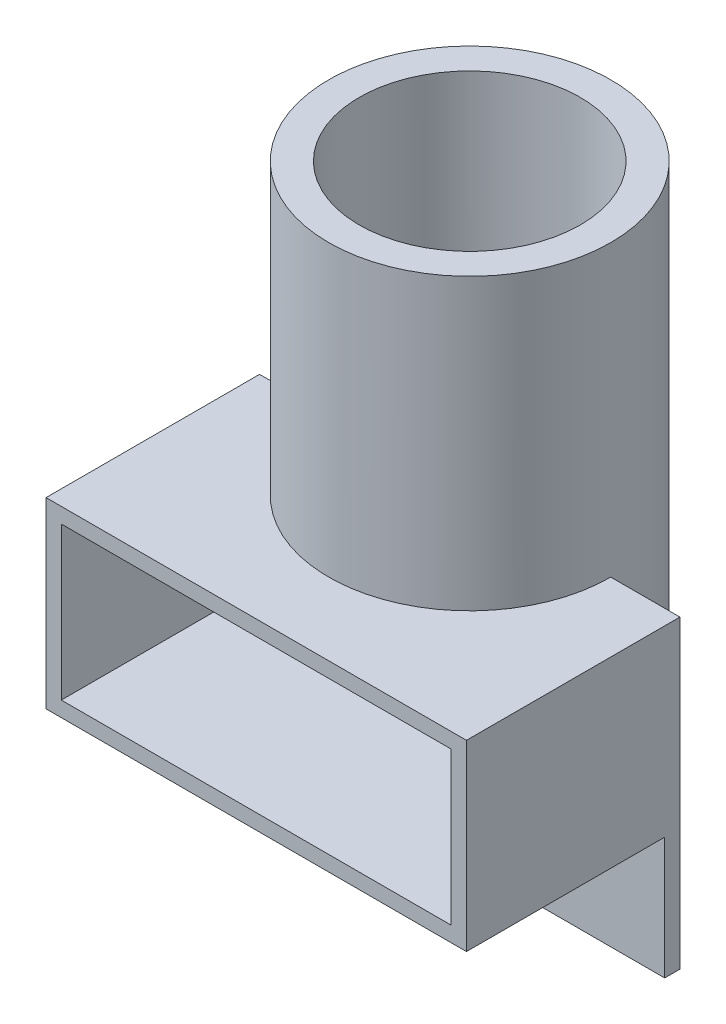
ISO-10303-21;
HEADER;
FILE_DESCRIPTION(('STEP AP214'),'2;1');
FILE_NAME('part.step','',(''),(''),'','','');
FILE_SCHEMA(('AUTOMOTIVE_DESIGN { 1 0 10303 214 1 1 1 1 }'));
ENDSEC;
DATA;
#1=APPLICATION_CONTEXT('core data for automotive mechanical design processes');
#2=APPLICATION_PROTOCOL_DEFINITION('international standard','automotive_design',2000,#1);
#3=PRODUCT_CONTEXT('',#1,'mechanical');
#4=PRODUCT('Part','Part','',(#3));
#5=PRODUCT_RELATED_PRODUCT_CATEGORY('part','',(#4));
#6=PRODUCT_DEFINITION_FORMATION('','',#4);
#7=PRODUCT_DEFINITION_CONTEXT('part definition',#1,'design');
#8=PRODUCT_DEFINITION('design','',#6,#7);
#9=PRODUCT_DEFINITION_SHAPE('','',#8);
#10=(LENGTH_UNIT() NAMED_UNIT(*) SI_UNIT(.MILLI.,.METRE.));
#11=(NAMED_UNIT(*) PLANE_ANGLE_UNIT() SI_UNIT($,.RADIAN.));
#12=(NAMED_UNIT(*) SI_UNIT($,.STERADIAN.) SOLID_ANGLE_UNIT());
#13=UNCERTAINTY_MEASURE_WITH_UNIT(LENGTH_MEASURE(1.E-05),#10,'distance_accuracy_value','');
#14=(GEOMETRIC_REPRESENTATION_CONTEXT(3) GLOBAL_UNCERTAINTY_ASSIGNED_CONTEXT((#13)) GLOBAL_UNIT_ASSIGNED_CONTEXT((#10,
#11,#12)) REPRESENTATION_CONTEXT('',''));
#15=CARTESIAN_POINT('',(0.,0.,0.));
#16=DIRECTION('',(0.,0.,1.));
#17=DIRECTION('',(1.,0.,0.));
#18=AXIS2_PLACEMENT_3D('',#15,#16,#17);
#19=CARTESIAN_POINT('',(-13.785,-12.,14.));
#20=DIRECTION('',(0.,1.,0.));
#21=DIRECTION('',(0.,0.,1.));
#22=AXIS2_PLACEMENT_3D('',#19,#20,#21);
#23=PLANE('',#22);
#24=DIRECTION('',(-1.,0.,0.));
#25=VECTOR('',#24,1.);
#26=CARTESIAN_POINT('',(-13.785,-12.,1.));
#27=LINE('',#26,#25);
#28=CARTESIAN_POINT('',(13.785,-12.,0.999999999999999));
#29=VERTEX_POINT('',#28);
#30=CARTESIAN_POINT('',(-13.785,-12.,1.));
#31=VERTEX_POINT('',#30);
#32=EDGE_CURVE('E59',#29,#31,#27,.T.);
#33=ORIENTED_EDGE('',*,*,#32,.F.);
#34=DIRECTION('',(0.,0.,-1.));
#35=VECTOR('',#34,1.);
#36=CARTESIAN_POINT('',(13.785,-12.,14.));
#37=LINE('',#36,#35);
#38=CARTESIAN_POINT('',(13.785,-12.,14.));
#39=VERTEX_POINT('',#38);
#40=EDGE_CURVE('E237',#39,#29,#37,.T.);
#41=ORIENTED_EDGE('',*,*,#40,.F.);
#42=DIRECTION('',(1.,0.,0.));
#43=VECTOR('',#42,1.);
#44=CARTESIAN_POINT('',(-13.785,-12.,14.));
#45=LINE('',#44,#43);
#46=CARTESIAN_POINT('',(-13.785,-12.,14.));
#47=VERTEX_POINT('',#46);
#48=EDGE_CURVE('E222',#47,#39,#45,.T.);
#49=ORIENTED_EDGE('',*,*,#48,.F.);
#50=DIRECTION('',(0.,0.,-1.));
#51=VECTOR('',#50,1.);
#52=CARTESIAN_POINT('',(-13.785,-12.,14.));
#53=LINE('',#52,#51);
#54=EDGE_CURVE('E239',#47,#31,#53,.T.);
#55=ORIENTED_EDGE('',*,*,#54,.T.);
#56=EDGE_LOOP('',(#33,#41,#49,#55));
#57=FACE_BOUND('',#56,.T.);
#58=ADVANCED_FACE('F39',(#57),#23,.F.);
#59=CARTESIAN_POINT('',(0.,19.,0.));
#60=DIRECTION('',(0.,1.,0.));
#61=DIRECTION('',(0.,0.,1.));
#62=AXIS2_PLACEMENT_3D('',#59,#60,#61);
#63=PLANE('',#62);
#64=CARTESIAN_POINT('',(0.,19.,0.));
#65=DIRECTION('',(0.,1.,0.));
#66=DIRECTION('',(0.,0.,1.));
#67=AXIS2_PLACEMENT_3D('',#64,#65,#66);
#68=CIRCLE('',#67,9.25);
#69=CARTESIAN_POINT('',(0.,19.,9.25));
#70=VERTEX_POINT('',#69);
#71=EDGE_CURVE('E269',#70,#70,#68,.T.);
#72=ORIENTED_EDGE('',*,*,#71,.T.);
#73=EDGE_LOOP('',(#72));
#74=FACE_BOUND('',#73,.T.);
#75=CARTESIAN_POINT('',(0.,19.,0.));
#76=DIRECTION('',(0.,1.,0.));
#77=DIRECTION('',(1.,0.,0.));
#78=AXIS2_PLACEMENT_3D('',#75,#76,#77);
#79=CIRCLE('',#78,7.25);
#80=CARTESIAN_POINT('',(7.25,19.,0.));
#81=VERTEX_POINT('',#80);
#82=EDGE_CURVE('E263',#81,#81,#79,.T.);
#83=ORIENTED_EDGE('',*,*,#82,.F.);
#84=EDGE_LOOP('',(#83));
#85=FACE_BOUND('',#84,.T.);
#86=ADVANCED_FACE('F289',(#74,#85),#63,.T.);
#87=CARTESIAN_POINT('',(0.,19.,0.));
#88=DIRECTION('',(0.,-1.,0.));
#89=DIRECTION('',(0.,0.,-1.));
#90=AXIS2_PLACEMENT_3D('',#87,#88,#89);
#91=CYLINDRICAL_SURFACE('',#90,9.25);
#92=ORIENTED_EDGE('',*,*,#71,.F.);
#93=EDGE_LOOP('',(#92));
#94=FACE_BOUND('',#93,.T.);
#95=CARTESIAN_POINT('',(0.,0.,0.));
#96=DIRECTION('',(0.,1.,0.));
#97=DIRECTION('',(0.,0.,1.));
#98=AXIS2_PLACEMENT_3D('',#95,#96,#97);
#99=CIRCLE('',#98,9.25);
#100=CARTESIAN_POINT('',(-9.25,0.,0.));
#101=VERTEX_POINT('',#100);
#102=CARTESIAN_POINT('',(9.25,0.,0.));
#103=VERTEX_POINT('',#102);
#104=EDGE_CURVE('E266',#101,#103,#99,.T.);
#105=ORIENTED_EDGE('',*,*,#104,.T.);
#106=DIRECTION('',(0.,1.,0.));
#107=VECTOR('',#106,1.);
#108=CARTESIAN_POINT('',(9.25,-11.,0.));
#109=LINE('',#108,#107);
#110=CARTESIAN_POINT('',(9.25,-11.,0.));
#111=VERTEX_POINT('',#110);
#112=EDGE_CURVE('E254',#111,#103,#109,.T.);
#113=ORIENTED_EDGE('',*,*,#112,.F.);
#114=CARTESIAN_POINT('',(0.,-11.,0.));
#115=DIRECTION('',(0.,1.,0.));
#116=DIRECTION('',(1.,0.,0.));
#117=AXIS2_PLACEMENT_3D('',#114,#115,#116);
#118=CIRCLE('',#117,9.25);
#119=CARTESIAN_POINT('',(-9.25,-11.,0.));
#120=VERTEX_POINT('',#119);
#121=EDGE_CURVE('E241',#111,#120,#118,.T.);
#122=ORIENTED_EDGE('',*,*,#121,.T.);
#123=DIRECTION('',(0.,1.,0.));
#124=VECTOR('',#123,1.);
#125=CARTESIAN_POINT('',(-9.25,-11.,0.));
#126=LINE('',#125,#124);
#127=EDGE_CURVE('E253',#120,#101,#126,.T.);
#128=ORIENTED_EDGE('',*,*,#127,.T.);
#129=EDGE_LOOP('',(#105,#113,#122,#128));
#130=FACE_BOUND('',#129,.T.);
#131=ADVANCED_FACE('F286',(#94,#130),#91,.T.);
#132=CARTESIAN_POINT('',(0.,19.,0.));
#133=DIRECTION('',(0.,-1.,0.));
#134=DIRECTION('',(0.,0.,-1.));
#135=AXIS2_PLACEMENT_3D('',#132,#133,#134);
#136=CYLINDRICAL_SURFACE('',#135,7.25);
#137=ORIENTED_EDGE('',*,*,#82,.T.);
#138=EDGE_LOOP('',(#137));
#139=FACE_BOUND('',#138,.T.);
#140=CARTESIAN_POINT('',(0.,0.,0.));
#141=DIRECTION('',(0.,1.,0.));
#142=DIRECTION('',(1.,0.,0.));
#143=AXIS2_PLACEMENT_3D('',#140,#141,#142);
#144=CIRCLE('',#143,7.25);
#145=CARTESIAN_POINT('',(-5.25,0.,5.));
#146=VERTEX_POINT('',#145);
#147=CARTESIAN_POINT('',(5.25,0.,5.));
#148=VERTEX_POINT('',#147);
#149=EDGE_CURVE('E256',#146,#148,#144,.T.);
#150=ORIENTED_EDGE('',*,*,#149,.F.);
#151=CARTESIAN_POINT('',(-5.25,0.,5.));
#152=CARTESIAN_POINT('',(-5.3451145283237,6.72036745505073E-06,4.90016158246677));
#153=CARTESIAN_POINT('',(-5.43738218212727,-0.00299091061629793,4.79754530995999));
#154=CARTESIAN_POINT('',(-5.61580223936952,-0.0159419032229641,4.58739550009041));
#155=CARTESIAN_POINT('',(-5.70194904364744,-0.0259015454774106,4.47985760471527));
#156=CARTESIAN_POINT('',(-5.86783992149923,-0.0537787125170177,4.26027876062175));
#157=CARTESIAN_POINT('',(-5.94755901119815,-0.0717256732301227,4.14822256258746));
#158=CARTESIAN_POINT('',(-6.09973829113947,-0.11643635995096,3.92101703700398));
#159=CARTESIAN_POINT('',(-6.17220066770498,-0.143197419937248,3.80586865441627));
#160=CARTESIAN_POINT('',(-6.30993058437847,-0.206455006489721,3.57291173916938));
#161=CARTESIAN_POINT('',(-6.37515042969233,-0.243011214241286,3.45509109417369));
#162=CARTESIAN_POINT('',(-6.49761494434465,-0.326318480212601,3.218881607688));
#163=CARTESIAN_POINT('',(-6.55485887032841,-0.373070487639397,3.10049271429957));
#164=CARTESIAN_POINT('',(-6.66113998087318,-0.476905770082516,2.86502272720656));
#165=CARTESIAN_POINT('',(-6.71019973373815,-0.533959699671592,2.74793889670932));
#166=CARTESIAN_POINT('',(-6.80044608266931,-0.658499139606163,2.51632264936274));
#167=CARTESIAN_POINT('',(-6.84163352366435,-0.725983529051121,2.40178995986855));
#168=CARTESIAN_POINT('',(-6.91277736187319,-0.863904929726459,2.18801596647575));
#169=CARTESIAN_POINT('',(-6.9434436213029,-0.933379290067125,2.08838741677289));
#170=CARTESIAN_POINT('',(-6.99911652319446,-1.08027610870968,1.89344841871119));
#171=CARTESIAN_POINT('',(-7.02412123140949,-1.15770127027972,1.7981394549901));
#172=CARTESIAN_POINT('',(-7.06898611954651,-1.32006979901924,1.6127732090239));
#173=CARTESIAN_POINT('',(-7.08884334493652,-1.40501744655615,1.52271896573832));
#174=CARTESIAN_POINT('',(-7.12399807100813,-1.58188331895337,1.3487160222802));
#175=CARTESIAN_POINT('',(-7.13929388686244,-1.67380410376358,1.26476958675512));
#176=CARTESIAN_POINT('',(-7.16603801573699,-1.86455870452197,1.10324211577086));
#177=CARTESIAN_POINT('',(-7.17746271562469,-1.96343065702698,1.02570225357129));
#178=CARTESIAN_POINT('',(-7.19700939448587,-2.16699026298681,0.878123253014978));
#179=CARTESIAN_POINT('',(-7.20512995274514,-2.2716803961986,0.808087350724071));
#180=CARTESIAN_POINT('',(-7.21871674335994,-2.48618409156783,0.67604421019692));
#181=CARTESIAN_POINT('',(-7.22418267015229,-2.59599824193498,0.614037896814176));
#182=CARTESIAN_POINT('',(-7.23307595415756,-2.82006478878222,0.498469663703473));
#183=CARTESIAN_POINT('',(-7.23650320361074,-2.93431741953006,0.444908190460046));
#184=CARTESIAN_POINT('',(-7.24208201015305,-3.17531735694903,0.342863619284048));
#185=CARTESIAN_POINT('',(-7.24411818570104,-3.30235798125257,0.295065807894278));
#186=CARTESIAN_POINT('',(-7.2470840567468,-3.55987412384438,0.209966438653844));
#187=CARTESIAN_POINT('',(-7.24801408969467,-3.6903485821537,0.172661682347623));
#188=CARTESIAN_POINT('',(-7.24925362277717,-3.95374481193901,0.108814557190168));
#189=CARTESIAN_POINT('',(-7.24956383121627,-4.08666361456563,0.082259931341745));
#190=CARTESIAN_POINT('',(-7.24992040275255,-4.3541651217917,0.0400386669042414));
#191=CARTESIAN_POINT('',(-7.24996690500028,-4.48874691129719,0.024366289881953));
#192=CARTESIAN_POINT('',(-7.24999505899875,-4.68635358667279,0.00945129871457457));
#193=CARTESIAN_POINT('',(-7.24999810836349,-4.74907951051302,0.00590488536153686));
#194=CARTESIAN_POINT('',(-7.25000016113569,-4.87453469872719,0.00118093769944767));
#195=CARTESIAN_POINT('',(-7.24999917006386,-4.93726384151095,1.74346020091124E-07));
#196=CARTESIAN_POINT('',(-7.25,-5.,0.));
#197=B_SPLINE_CURVE_WITH_KNOTS('',3,(#151,#152,#153,#154,#155,#156,#157,#158,#159,#160,#161,
#162,#163,#164,#165,#166,#167,#168,#169,#170,#171,#172,#173,#174,#175,#176,#177,#178,#179,#180,
#181,#182,#183,#184,#185,#186,#187,#188,#189,#190,#191,#192,#193,#194,#195,#196),.UNSPECIFIED.,
.F.,.F.,(4,2,2,2,2,2,2,2,2,2,2,2,2,2,2,2,2,2,2,2,2,2,4),(0.,0.413661467971635,0.827696594321726,
1.24327037843539,1.6587185782243,2.07675802079351,2.49483639856348,2.91174213058768,
3.32860309130095,3.7039672367654,4.07945943106528,4.45516667406093,4.83101251895163,
5.20911133786372,5.58737256026909,5.96567731238001,6.34400205902236,6.75079123968589,
7.15745628961978,7.56365635666923,7.96964206308146,8.15808280479186,8.34626615457649),.UNSPECIFIED.);
#198=CARTESIAN_POINT('',(-7.25,-5.,0.));
#199=VERTEX_POINT('',#198);
#200=EDGE_CURVE('E52',#146,#199,#197,.T.);
#201=ORIENTED_EDGE('',*,*,#200,.T.);
#202=DIRECTION('',(0.,1.,0.));
#203=VECTOR('',#202,1.);
#204=CARTESIAN_POINT('',(-7.25,-11.,0.));
#205=LINE('',#204,#203);
#206=CARTESIAN_POINT('',(-7.25,-11.,0.));
#207=VERTEX_POINT('',#206);
#208=EDGE_CURVE('E259',#207,#199,#205,.T.);
#209=ORIENTED_EDGE('',*,*,#208,.F.);
#210=CARTESIAN_POINT('',(0.,-11.,0.));
#211=DIRECTION('',(0.,1.,0.));
#212=DIRECTION('',(0.,0.,1.));
#213=AXIS2_PLACEMENT_3D('',#210,#211,#212);
#214=CIRCLE('',#213,7.25);
#215=CARTESIAN_POINT('',(7.25,-11.,0.));
#216=VERTEX_POINT('',#215);
#217=EDGE_CURVE('E247',#216,#207,#214,.T.);
#218=ORIENTED_EDGE('',*,*,#217,.F.);
#219=DIRECTION('',(0.,1.,0.));
#220=VECTOR('',#219,1.);
#221=CARTESIAN_POINT('',(7.25,-11.,0.));
#222=LINE('',#221,#220);
#223=CARTESIAN_POINT('',(7.25,-5.,0.));
#224=VERTEX_POINT('',#223);
#225=EDGE_CURVE('E257',#216,#224,#222,.T.);
#226=ORIENTED_EDGE('',*,*,#225,.T.);
#227=CARTESIAN_POINT('',(7.25,-5.,0.));
#228=CARTESIAN_POINT('',(7.24996976463803,-4.86005571811214,-1.48250933784358E-05));
#229=CARTESIAN_POINT('',(7.24999904964399,-4.72011353748819,0.00587470339202107));
#230=CARTESIAN_POINT('',(7.24995815241415,-4.44121797609597,0.0293555967045467));
#231=CARTESIAN_POINT('',(7.24988797293112,-4.3022645680693,0.0469466376721602));
#232=CARTESIAN_POINT('',(7.24942956379429,-4.02626461165057,0.0937336439348905));
#233=CARTESIAN_POINT('',(7.24904119887723,-3.88921889943845,0.122934541957996));
#234=CARTESIAN_POINT('',(7.24752240686202,-3.61806526577579,0.192729251203325));
#235=CARTESIAN_POINT('',(7.24639198899191,-3.48395730781328,0.233322920743416));
#236=CARTESIAN_POINT('',(7.24283018555517,-3.21955371424099,0.325641096600181));
#237=CARTESIAN_POINT('',(7.2403980151502,-3.0892604285664,0.377372306581703));
#238=CARTESIAN_POINT('',(7.23354090365725,-2.83347139013595,0.4915880932716));
#239=CARTESIAN_POINT('',(7.22911526448352,-2.70797733472164,0.554076432240735));
#240=CARTESIAN_POINT('',(7.21747931174951,-2.46284243398618,0.689267910410459));
#241=CARTESIAN_POINT('',(7.21027061671815,-2.34319823207296,0.761965096892798));
#242=CARTESIAN_POINT('',(7.19219839033466,-2.1106144887642,0.916988895251322));
#243=CARTESIAN_POINT('',(7.18133511181111,-1.99767448419975,0.999314840741225));
#244=CARTESIAN_POINT('',(7.15529405053158,-1.78147944154935,1.17118445710116));
#245=CARTESIAN_POINT('',(7.1402026769215,-1.67808057787443,1.26056015045233));
#246=CARTESIAN_POINT('',(7.10477679610745,-1.47944520746101,1.44694050930957));
#247=CARTESIAN_POINT('',(7.08444454626402,-1.38420520999259,1.54394187779875));
#248=CARTESIAN_POINT('',(7.03773792176752,-1.20261619384074,1.74451708416717));
#249=CARTESIAN_POINT('',(7.01136609082867,-1.11626345420544,1.848088141824));
#250=CARTESIAN_POINT('',(6.95187292169265,-0.953030624999543,2.06061449237426));
#251=CARTESIAN_POINT('',(6.91875211946962,-0.876149783989175,2.16956935718883));
#252=CARTESIAN_POINT('',(6.84790498656479,-0.737576599463736,2.38336651478872));
#253=CARTESIAN_POINT('',(6.81069281442489,-0.675184585231736,2.48792658651383));
#254=CARTESIAN_POINT('',(6.72970881173504,-0.559120834241422,2.69931967764757));
#255=CARTESIAN_POINT('',(6.68593716491928,-0.50544885331832,2.80615263331967));
#256=CARTESIAN_POINT('',(6.59169210832506,-0.406838369656374,3.02090158664644));
#257=CARTESIAN_POINT('',(6.54121781923854,-0.361901014706962,3.12881772468186));
#258=CARTESIAN_POINT('',(6.43359033308065,-0.280599824378117,3.34453947315803));
#259=CARTESIAN_POINT('',(6.37643723617048,-0.244235860449364,3.45234508523188));
#260=CARTESIAN_POINT('',(6.2570454580368,-0.180501323180982,3.6641936403001));
#261=CARTESIAN_POINT('',(6.19495991417058,-0.152937559572754,3.76826511722247));
#262=CARTESIAN_POINT('',(6.06479010104923,-0.10517648414601,3.97437846020822));
#263=CARTESIAN_POINT('',(5.99670335402278,-0.08498223290094,4.07641946641768));
#264=CARTESIAN_POINT('',(5.85493812958421,-0.0514209700585268,4.27753732962137));
#265=CARTESIAN_POINT('',(5.78126497967316,-0.0380475455088263,4.37661688813834));
#266=CARTESIAN_POINT('',(5.62861767241399,-0.0174541755632059,4.57126430607824));
#267=CARTESIAN_POINT('',(5.54964372395558,-0.0102339878387697,4.66683230365261));
#268=CARTESIAN_POINT('',(5.43273462242104,-0.00378982501425234,4.80112686516217));
#269=CARTESIAN_POINT('',(5.39678385400653,-0.00235272672764875,4.84150268713879));
#270=CARTESIAN_POINT('',(5.3240341885731,-0.000458677663046953,4.92138932847025));
#271=CARTESIAN_POINT('',(5.28723672852402,-1.74558942454911E-07,4.96090141923592));
#272=CARTESIAN_POINT('',(5.25,0.,5.));
#273=B_SPLINE_CURVE_WITH_KNOTS('',3,(#227,#228,#229,#230,#231,#232,#233,#234,#235,#236,#237,
#238,#239,#240,#241,#242,#243,#244,#245,#246,#247,#248,#249,#250,#251,#252,#253,#254,#255,#256,
#257,#258,#259,#260,#261,#262,#263,#264,#265,#266,#267,#268,#269,#270,#271,#272),.UNSPECIFIED.,
.F.,.F.,(4,2,2,2,2,2,2,2,2,2,2,2,2,2,2,2,2,2,2,2,2,2,4),(0.,0.419705998981521,0.839400382359899,
1.25927327391011,1.67914094409246,2.09926204190632,2.51953037495236,2.93955466177625,
3.35954989677909,3.77151975219701,4.18331245879679,4.59493204696039,5.00651895880574,
5.3879966641564,5.76946368612107,6.15098080161576,6.53249219628361,6.90493698278398,
7.27753627080562,7.64978459157754,8.02201825168307,8.18424266542027,8.34620955394533),.UNSPECIFIED.);
#274=EDGE_CURVE('E12',#224,#148,#273,.T.);
#275=ORIENTED_EDGE('',*,*,#274,.T.);
#276=EDGE_LOOP('',(#150,#201,#209,#218,#226,#275));
#277=FACE_BOUND('',#276,.T.);
#278=ADVANCED_FACE('F280',(#139,#277),#136,.F.);
#279=CARTESIAN_POINT('',(0.,-11.,0.));
#280=DIRECTION('',(0.,1.,0.));
#281=DIRECTION('',(1.,0.,0.));
#282=AXIS2_PLACEMENT_3D('',#279,#280,#281);
#283=PLANE('',#282);
#284=ORIENTED_EDGE('',*,*,#121,.F.);
#285=DIRECTION('',(-1.,0.,0.));
#286=VECTOR('',#285,1.);
#287=CARTESIAN_POINT('',(9.25,-11.,0.));
#288=LINE('',#287,#286);
#289=EDGE_CURVE('E250',#111,#216,#288,.T.);
#290=ORIENTED_EDGE('',*,*,#289,.T.);
#291=ORIENTED_EDGE('',*,*,#217,.T.);
#292=DIRECTION('',(-1.,0.,0.));
#293=VECTOR('',#292,1.);
#294=CARTESIAN_POINT('',(-7.25,-11.,0.));
#295=LINE('',#294,#293);
#296=EDGE_CURVE('E244',#207,#120,#295,.T.);
#297=ORIENTED_EDGE('',*,*,#296,.T.);
#298=EDGE_LOOP('',(#284,#290,#291,#297));
#299=FACE_BOUND('',#298,.T.);
#300=ADVANCED_FACE('F285',(#299),#283,.F.);
#301=CARTESIAN_POINT('',(-13.785,0.,14.));
#302=DIRECTION('',(0.,-1.,0.));
#303=DIRECTION('',(0.,0.,-1.));
#304=AXIS2_PLACEMENT_3D('',#301,#302,#303);
#305=PLANE('',#304);
#306=DIRECTION('',(-1.,0.,0.));
#307=VECTOR('',#306,1.);
#308=CARTESIAN_POINT('',(-13.785,0.,0.));
#309=LINE('',#308,#307);
#310=CARTESIAN_POINT('',(13.785,0.,0.));
#311=VERTEX_POINT('',#310);
#312=EDGE_CURVE('E223',#311,#103,#309,.T.);
#313=ORIENTED_EDGE('',*,*,#312,.T.);
#314=ORIENTED_EDGE('',*,*,#104,.F.);
#315=CARTESIAN_POINT('',(-13.785,0.,0.));
#316=VERTEX_POINT('',#315);
#317=EDGE_CURVE('E230',#101,#316,#309,.T.);
#318=ORIENTED_EDGE('',*,*,#317,.T.);
#319=DIRECTION('',(0.,0.,-1.));
#320=VECTOR('',#319,1.);
#321=CARTESIAN_POINT('',(-13.785,0.,14.));
#322=LINE('',#321,#320);
#323=CARTESIAN_POINT('',(-13.785,0.,14.));
#324=VERTEX_POINT('',#323);
#325=EDGE_CURVE('E161',#324,#316,#322,.T.);
#326=ORIENTED_EDGE('',*,*,#325,.F.);
#327=DIRECTION('',(-1.,0.,0.));
#328=VECTOR('',#327,1.);
#329=CARTESIAN_POINT('',(-13.785,0.,14.));
#330=LINE('',#329,#328);
#331=CARTESIAN_POINT('',(13.785,0.,14.));
#332=VERTEX_POINT('',#331);
#333=EDGE_CURVE('E227',#332,#324,#330,.T.);
#334=ORIENTED_EDGE('',*,*,#333,.F.);
#335=DIRECTION('',(0.,0.,-1.));
#336=VECTOR('',#335,1.);
#337=CARTESIAN_POINT('',(13.785,0.,14.));
#338=LINE('',#337,#336);
#339=EDGE_CURVE('E234',#332,#311,#338,.T.);
#340=ORIENTED_EDGE('',*,*,#339,.T.);
#341=EDGE_LOOP('',(#313,#314,#318,#326,#334,#340));
#342=FACE_BOUND('',#341,.T.);
#343=ADVANCED_FACE('F313',(#342),#305,.F.);
#344=CARTESIAN_POINT('',(0.,0.,0.));
#345=DIRECTION('',(0.,0.,1.));
#346=DIRECTION('',(1.,0.,0.));
#347=AXIS2_PLACEMENT_3D('',#344,#345,#346);
#348=PLANE('',#347);
#349=ORIENTED_EDGE('',*,*,#208,.T.);
#350=DIRECTION('',(-1.,0.,0.));
#351=VECTOR('',#350,1.);
#352=CARTESIAN_POINT('',(0.,-5.,0.));
#353=LINE('',#352,#351);
#354=EDGE_CURVE('E67',#199,#224,#353,.F.);
#355=ORIENTED_EDGE('',*,*,#354,.T.);
#356=ORIENTED_EDGE('',*,*,#225,.F.);
#357=ORIENTED_EDGE('',*,*,#289,.F.);
#358=ORIENTED_EDGE('',*,*,#112,.T.);
#359=ORIENTED_EDGE('',*,*,#312,.F.);
#360=DIRECTION('',(0.,1.,0.));
#361=VECTOR('',#360,1.);
#362=CARTESIAN_POINT('',(13.785,0.,0.));
#363=LINE('',#362,#361);
#364=CARTESIAN_POINT('',(13.785,-20.,0.));
#365=VERTEX_POINT('',#364);
#366=EDGE_CURVE('E163',#365,#311,#363,.T.);
#367=ORIENTED_EDGE('',*,*,#366,.F.);
#368=DIRECTION('',(1.,0.,0.));
#369=VECTOR('',#368,1.);
#370=CARTESIAN_POINT('',(-13.785,-20.,0.));
#371=LINE('',#370,#369);
#372=CARTESIAN_POINT('',(-13.785,-20.,0.));
#373=VERTEX_POINT('',#372);
#374=EDGE_CURVE('E167',#373,#365,#371,.T.);
#375=ORIENTED_EDGE('',*,*,#374,.F.);
#376=DIRECTION('',(0.,-1.,0.));
#377=VECTOR('',#376,1.);
#378=CARTESIAN_POINT('',(-13.785,0.,0.));
#379=LINE('',#378,#377);
#380=EDGE_CURVE('E153',#316,#373,#379,.T.);
#381=ORIENTED_EDGE('',*,*,#380,.F.);
#382=ORIENTED_EDGE('',*,*,#317,.F.);
#383=ORIENTED_EDGE('',*,*,#127,.F.);
#384=ORIENTED_EDGE('',*,*,#296,.F.);
#385=EDGE_LOOP('',(#349,#355,#356,#357,#358,#359,#367,#375,#381,#382,#383,#384));
#386=FACE_BOUND('',#385,.T.);
#387=ADVANCED_FACE('F168',(#386),#348,.F.);
#388=CARTESIAN_POINT('',(-13.785,0.,14.));
#389=DIRECTION('',(1.,0.,0.));
#390=DIRECTION('',(0.,1.,0.));
#391=AXIS2_PLACEMENT_3D('',#388,#389,#390);
#392=PLANE('',#391);
#393=ORIENTED_EDGE('',*,*,#380,.T.);
#394=DIRECTION('',(0.,0.,-1.));
#395=VECTOR('',#394,1.);
#396=CARTESIAN_POINT('',(-13.785,-20.,0.));
#397=LINE('',#396,#395);
#398=CARTESIAN_POINT('',(-13.785,-20.,1.));
#399=VERTEX_POINT('',#398);
#400=EDGE_CURVE('E158',#399,#373,#397,.T.);
#401=ORIENTED_EDGE('',*,*,#400,.F.);
#402=DIRECTION('',(0.,1.,0.));
#403=VECTOR('',#402,1.);
#404=CARTESIAN_POINT('',(-13.785,-20.,1.));
#405=LINE('',#404,#403);
#406=EDGE_CURVE('E182',#399,#31,#405,.T.);
#407=ORIENTED_EDGE('',*,*,#406,.T.);
#408=ORIENTED_EDGE('',*,*,#54,.F.);
#409=DIRECTION('',(0.,-1.,0.));
#410=VECTOR('',#409,1.);
#411=CARTESIAN_POINT('',(-13.785,0.,14.));
#412=LINE('',#411,#410);
#413=EDGE_CURVE('E219',#324,#47,#412,.T.);
#414=ORIENTED_EDGE('',*,*,#413,.F.);
#415=ORIENTED_EDGE('',*,*,#325,.T.);
#416=EDGE_LOOP('',(#393,#401,#407,#408,#414,#415));
#417=FACE_BOUND('',#416,.T.);
#418=ADVANCED_FACE('F155',(#417),#392,.F.);
#419=CARTESIAN_POINT('',(13.785,0.,14.));
#420=DIRECTION('',(-1.,0.,0.));
#421=DIRECTION('',(0.,-1.,0.));
#422=AXIS2_PLACEMENT_3D('',#419,#420,#421);
#423=PLANE('',#422);
#424=ORIENTED_EDGE('',*,*,#366,.T.);
#425=ORIENTED_EDGE('',*,*,#339,.F.);
#426=DIRECTION('',(0.,1.,0.));
#427=VECTOR('',#426,1.);
#428=CARTESIAN_POINT('',(13.785,0.,14.));
#429=LINE('',#428,#427);
#430=EDGE_CURVE('E225',#39,#332,#429,.T.);
#431=ORIENTED_EDGE('',*,*,#430,.F.);
#432=ORIENTED_EDGE('',*,*,#40,.T.);
#433=DIRECTION('',(0.,1.,0.));
#434=VECTOR('',#433,1.);
#435=CARTESIAN_POINT('',(13.785,-20.,1.));
#436=LINE('',#435,#434);
#437=CARTESIAN_POINT('',(13.785,-20.,1.));
#438=VERTEX_POINT('',#437);
#439=EDGE_CURVE('E185',#438,#29,#436,.T.);
#440=ORIENTED_EDGE('',*,*,#439,.F.);
#441=DIRECTION('',(0.,0.,1.));
#442=VECTOR('',#441,1.);
#443=CARTESIAN_POINT('',(13.785,-20.,0.));
#444=LINE('',#443,#442);
#445=EDGE_CURVE('E172',#365,#438,#444,.T.);
#446=ORIENTED_EDGE('',*,*,#445,.F.);
#447=EDGE_LOOP('',(#424,#425,#431,#432,#440,#446));
#448=FACE_BOUND('',#447,.T.);
#449=ADVANCED_FACE('F304',(#448),#423,.F.);
#450=ORIENTED_EDGE('',*,*,#149,.T.);
#451=DIRECTION('',(-1.,0.,0.));
#452=VECTOR('',#451,1.);
#453=CARTESIAN_POINT('',(-13.785,0.,5.));
#454=LINE('',#453,#452);
#455=EDGE_CURVE('E272',#148,#146,#454,.T.);
#456=ORIENTED_EDGE('',*,*,#455,.T.);
#457=EDGE_LOOP('',(#450,#456));
#458=FACE_BOUND('',#457,.T.);
#459=ADVANCED_FACE('F311',(#458),#305,.F.);
#460=CARTESIAN_POINT('',(0.,0.,14.));
#461=DIRECTION('',(0.,0.,1.));
#462=DIRECTION('',(1.,0.,0.));
#463=AXIS2_PLACEMENT_3D('',#460,#461,#462);
#464=PLANE('',#463);
#465=DIRECTION('',(0.,-1.,0.));
#466=VECTOR('',#465,1.);
#467=CARTESIAN_POINT('',(-12.785,-1.,14.));
#468=LINE('',#467,#466);
#469=CARTESIAN_POINT('',(-12.785,-1.,14.));
#470=VERTEX_POINT('',#469);
#471=CARTESIAN_POINT('',(-12.785,-11.,14.));
#472=VERTEX_POINT('',#471);
#473=EDGE_CURVE('E188',#470,#472,#468,.T.);
#474=ORIENTED_EDGE('',*,*,#473,.F.);
#475=DIRECTION('',(-1.,0.,0.));
#476=VECTOR('',#475,1.);
#477=CARTESIAN_POINT('',(-12.785,-1.,14.));
#478=LINE('',#477,#476);
#479=CARTESIAN_POINT('',(12.785,-1.,14.));
#480=VERTEX_POINT('',#479);
#481=EDGE_CURVE('E193',#480,#470,#478,.T.);
#482=ORIENTED_EDGE('',*,*,#481,.F.);
#483=DIRECTION('',(0.,1.,0.));
#484=VECTOR('',#483,1.);
#485=CARTESIAN_POINT('',(12.785,-1.,14.));
#486=LINE('',#485,#484);
#487=CARTESIAN_POINT('',(12.785,-11.,14.));
#488=VERTEX_POINT('',#487);
#489=EDGE_CURVE('E207',#488,#480,#486,.T.);
#490=ORIENTED_EDGE('',*,*,#489,.F.);
#491=DIRECTION('',(1.,0.,0.));
#492=VECTOR('',#491,1.);
#493=CARTESIAN_POINT('',(-12.785,-11.,14.));
#494=LINE('',#493,#492);
#495=EDGE_CURVE('E204',#472,#488,#494,.T.);
#496=ORIENTED_EDGE('',*,*,#495,.F.);
#497=EDGE_LOOP('',(#474,#482,#490,#496));
#498=FACE_BOUND('',#497,.T.);
#499=ORIENTED_EDGE('',*,*,#413,.T.);
#500=ORIENTED_EDGE('',*,*,#48,.T.);
#501=ORIENTED_EDGE('',*,*,#430,.T.);
#502=ORIENTED_EDGE('',*,*,#333,.T.);
#503=EDGE_LOOP('',(#499,#500,#501,#502));
#504=FACE_BOUND('',#503,.T.);
#505=ADVANCED_FACE('F320',(#498,#504),#464,.T.);
#506=CARTESIAN_POINT('',(-12.785,-1.,2.));
#507=DIRECTION('',(-1.,0.,0.));
#508=DIRECTION('',(0.,-1.,0.));
#509=AXIS2_PLACEMENT_3D('',#506,#507,#508);
#510=PLANE('',#509);
#511=ORIENTED_EDGE('',*,*,#473,.T.);
#512=DIRECTION('',(0.,0.,1.));
#513=VECTOR('',#512,1.);
#514=CARTESIAN_POINT('',(-12.785,-11.,2.));
#515=LINE('',#514,#513);
#516=CARTESIAN_POINT('',(-12.785,-11.,2.));
#517=VERTEX_POINT('',#516);
#518=EDGE_CURVE('E202',#517,#472,#515,.T.);
#519=ORIENTED_EDGE('',*,*,#518,.F.);
#520=DIRECTION('',(0.,-1.,0.));
#521=VECTOR('',#520,1.);
#522=CARTESIAN_POINT('',(-12.785,-1.,2.));
#523=LINE('',#522,#521);
#524=CARTESIAN_POINT('',(-12.785,-1.,2.));
#525=VERTEX_POINT('',#524);
#526=EDGE_CURVE('E189',#525,#517,#523,.T.);
#527=ORIENTED_EDGE('',*,*,#526,.F.);
#528=DIRECTION('',(0.,0.,1.));
#529=VECTOR('',#528,1.);
#530=CARTESIAN_POINT('',(-12.785,-1.,2.));
#531=LINE('',#530,#529);
#532=EDGE_CURVE('E164',#525,#470,#531,.T.);
#533=ORIENTED_EDGE('',*,*,#532,.T.);
#534=EDGE_LOOP('',(#511,#519,#527,#533));
#535=FACE_BOUND('',#534,.T.);
#536=ADVANCED_FACE('F327',(#535),#510,.F.);
#537=CARTESIAN_POINT('',(-12.785,-1.,2.));
#538=DIRECTION('',(0.,1.,0.));
#539=DIRECTION('',(0.,0.,1.));
#540=AXIS2_PLACEMENT_3D('',#537,#538,#539);
#541=PLANE('',#540);
#542=ORIENTED_EDGE('',*,*,#481,.T.);
#543=ORIENTED_EDGE('',*,*,#532,.F.);
#544=DIRECTION('',(-1.,0.,0.));
#545=VECTOR('',#544,1.);
#546=CARTESIAN_POINT('',(-12.785,-1.,2.));
#547=LINE('',#546,#545);
#548=CARTESIAN_POINT('',(12.785,-1.,2.));
#549=VERTEX_POINT('',#548);
#550=EDGE_CURVE('E199',#549,#525,#547,.T.);
#551=ORIENTED_EDGE('',*,*,#550,.F.);
#552=DIRECTION('',(0.,0.,1.));
#553=VECTOR('',#552,1.);
#554=CARTESIAN_POINT('',(12.785,-1.,2.));
#555=LINE('',#554,#553);
#556=EDGE_CURVE('E213',#549,#480,#555,.T.);
#557=ORIENTED_EDGE('',*,*,#556,.T.);
#558=EDGE_LOOP('',(#542,#543,#551,#557));
#559=FACE_BOUND('',#558,.T.);
#560=ADVANCED_FACE('F360',(#559),#541,.F.);
#561=CARTESIAN_POINT('',(12.785,-1.,2.));
#562=DIRECTION('',(1.,0.,0.));
#563=DIRECTION('',(0.,1.,0.));
#564=AXIS2_PLACEMENT_3D('',#561,#562,#563);
#565=PLANE('',#564);
#566=ORIENTED_EDGE('',*,*,#489,.T.);
#567=ORIENTED_EDGE('',*,*,#556,.F.);
#568=DIRECTION('',(0.,1.,0.));
#569=VECTOR('',#568,1.);
#570=CARTESIAN_POINT('',(12.785,-1.,2.));
#571=LINE('',#570,#569);
#572=CARTESIAN_POINT('',(12.785,-11.,2.));
#573=VERTEX_POINT('',#572);
#574=EDGE_CURVE('E196',#573,#549,#571,.T.);
#575=ORIENTED_EDGE('',*,*,#574,.F.);
#576=DIRECTION('',(0.,0.,1.));
#577=VECTOR('',#576,1.);
#578=CARTESIAN_POINT('',(12.785,-11.,2.));
#579=LINE('',#578,#577);
#580=EDGE_CURVE('E215',#573,#488,#579,.T.);
#581=ORIENTED_EDGE('',*,*,#580,.T.);
#582=EDGE_LOOP('',(#566,#567,#575,#581));
#583=FACE_BOUND('',#582,.T.);
#584=ADVANCED_FACE('F363',(#583),#565,.F.);
#585=CARTESIAN_POINT('',(-12.785,-11.,2.));
#586=DIRECTION('',(0.,-1.,0.));
#587=DIRECTION('',(0.,0.,-1.));
#588=AXIS2_PLACEMENT_3D('',#585,#586,#587);
#589=PLANE('',#588);
#590=ORIENTED_EDGE('',*,*,#495,.T.);
#591=ORIENTED_EDGE('',*,*,#580,.F.);
#592=DIRECTION('',(1.,0.,0.));
#593=VECTOR('',#592,1.);
#594=CARTESIAN_POINT('',(-12.785,-11.,2.));
#595=LINE('',#594,#593);
#596=EDGE_CURVE('E192',#517,#573,#595,.T.);
#597=ORIENTED_EDGE('',*,*,#596,.F.);
#598=ORIENTED_EDGE('',*,*,#518,.T.);
#599=EDGE_LOOP('',(#590,#591,#597,#598));
#600=FACE_BOUND('',#599,.T.);
#601=ADVANCED_FACE('F358',(#600),#589,.F.);
#602=CARTESIAN_POINT('',(0.,0.,2.));
#603=DIRECTION('',(0.,0.,1.));
#604=DIRECTION('',(1.,0.,0.));
#605=AXIS2_PLACEMENT_3D('',#602,#603,#604);
#606=PLANE('',#605);
#607=ORIENTED_EDGE('',*,*,#526,.T.);
#608=ORIENTED_EDGE('',*,*,#596,.T.);
#609=ORIENTED_EDGE('',*,*,#574,.T.);
#610=ORIENTED_EDGE('',*,*,#550,.T.);
#611=EDGE_LOOP('',(#607,#608,#609,#610));
#612=FACE_BOUND('',#611,.T.);
#613=ADVANCED_FACE('F354',(#612),#606,.T.);
#614=CARTESIAN_POINT('',(-13.785,-5.,5.));
#615=DIRECTION('',(-1.,0.,0.));
#616=DIRECTION('',(0.,0.,1.));
#617=AXIS2_PLACEMENT_3D('',#614,#615,#616);
#618=CYLINDRICAL_SURFACE('',#617,5.);
#619=ORIENTED_EDGE('',*,*,#274,.F.);
#620=ORIENTED_EDGE('',*,*,#354,.F.);
#621=ORIENTED_EDGE('',*,*,#200,.F.);
#622=ORIENTED_EDGE('',*,*,#455,.F.);
#623=EDGE_LOOP('',(#619,#620,#621,#622));
#624=FACE_BOUND('',#623,.T.);
#625=ADVANCED_FACE('F41',(#624),#618,.T.);
#626=CARTESIAN_POINT('',(-13.785,-20.,1.));
#627=DIRECTION('',(0.,0.,-1.));
#628=DIRECTION('',(-1.,0.,0.));
#629=AXIS2_PLACEMENT_3D('',#626,#627,#628);
#630=PLANE('',#629);
#631=ORIENTED_EDGE('',*,*,#32,.T.);
#632=ORIENTED_EDGE('',*,*,#406,.F.);
#633=DIRECTION('',(-1.,0.,0.));
#634=VECTOR('',#633,1.);
#635=CARTESIAN_POINT('',(-13.785,-20.,1.));
#636=LINE('',#635,#634);
#637=EDGE_CURVE('E176',#438,#399,#636,.T.);
#638=ORIENTED_EDGE('',*,*,#637,.F.);
#639=ORIENTED_EDGE('',*,*,#439,.T.);
#640=EDGE_LOOP('',(#631,#632,#638,#639));
#641=FACE_BOUND('',#640,.T.);
#642=ADVANCED_FACE('F344',(#641),#630,.F.);
#643=CARTESIAN_POINT('',(0.,-20.,0.));
#644=DIRECTION('',(0.,1.,0.));
#645=DIRECTION('',(0.,0.,1.));
#646=AXIS2_PLACEMENT_3D('',#643,#644,#645);
#647=PLANE('',#646);
#648=ORIENTED_EDGE('',*,*,#400,.T.);
#649=ORIENTED_EDGE('',*,*,#374,.T.);
#650=ORIENTED_EDGE('',*,*,#445,.T.);
#651=ORIENTED_EDGE('',*,*,#637,.T.);
#652=EDGE_LOOP('',(#648,#649,#650,#651));
#653=FACE_BOUND('',#652,.T.);
#654=ADVANCED_FACE('F174',(#653),#647,.F.);
#655=CLOSED_SHELL('',(#58,#86,#131,#278,#300,#343,#387,#418,#449,#459,#505,#536,#560,#584,#601,
#613,#625,#642,#654));
#656=MANIFOLD_SOLID_BREP('B2',#655);
#657=ADVANCED_BREP_SHAPE_REPRESENTATION('',(#18,#656),#14);
#658=SHAPE_DEFINITION_REPRESENTATION(#9,#657);
ENDSEC;
END-ISO-10303-21;
